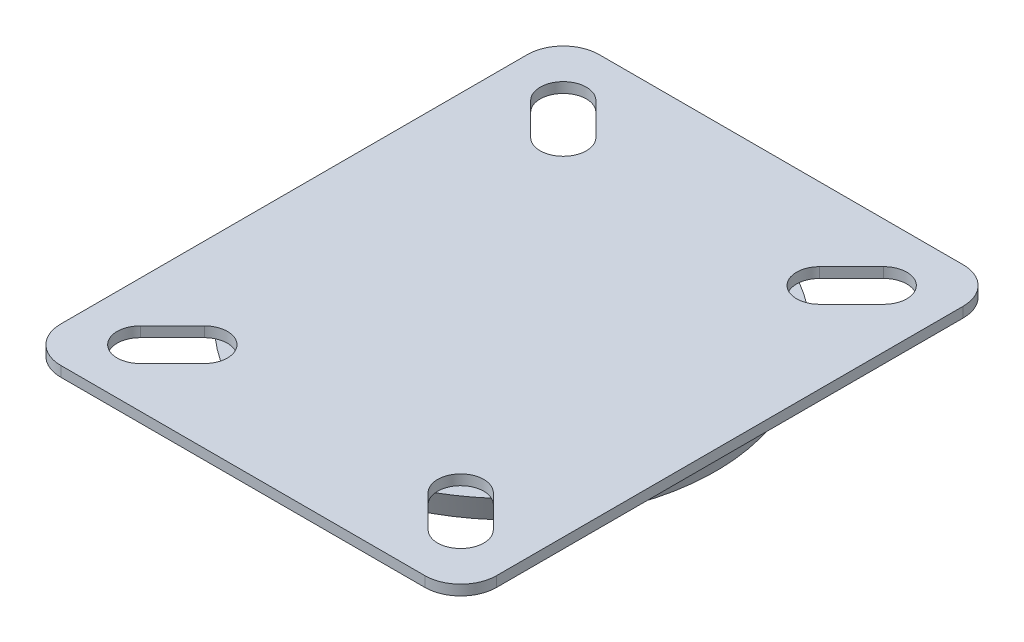
ISO-10303-21;
HEADER;
FILE_DESCRIPTION(('STEP AP214'),'2;1');
FILE_NAME('part.step','',(''),(''),'','','');
FILE_SCHEMA(('AUTOMOTIVE_DESIGN { 1 0 10303 214 1 1 1 1 }'));
ENDSEC;
DATA;
#1=APPLICATION_CONTEXT('core data for automotive mechanical design processes');
#2=APPLICATION_PROTOCOL_DEFINITION('international standard','automotive_design',2000,#1);
#3=PRODUCT_CONTEXT('',#1,'mechanical');
#4=PRODUCT('Part','Part','',(#3));
#5=PRODUCT_RELATED_PRODUCT_CATEGORY('part','',(#4));
#6=PRODUCT_DEFINITION_FORMATION('','',#4);
#7=PRODUCT_DEFINITION_CONTEXT('part definition',#1,'design');
#8=PRODUCT_DEFINITION('design','',#6,#7);
#9=PRODUCT_DEFINITION_SHAPE('','',#8);
#10=(LENGTH_UNIT() NAMED_UNIT(*) SI_UNIT(.MILLI.,.METRE.));
#11=(NAMED_UNIT(*) PLANE_ANGLE_UNIT() SI_UNIT($,.RADIAN.));
#12=(NAMED_UNIT(*) SI_UNIT($,.STERADIAN.) SOLID_ANGLE_UNIT());
#13=UNCERTAINTY_MEASURE_WITH_UNIT(LENGTH_MEASURE(1.E-05),#10,'distance_accuracy_value','');
#14=(GEOMETRIC_REPRESENTATION_CONTEXT(3) GLOBAL_UNCERTAINTY_ASSIGNED_CONTEXT((#13)) GLOBAL_UNIT_ASSIGNED_CONTEXT((#10,
#11,#12)) REPRESENTATION_CONTEXT('',''));
#15=CARTESIAN_POINT('',(0.,0.,0.));
#16=DIRECTION('',(0.,0.,1.));
#17=DIRECTION('',(1.,0.,0.));
#18=AXIS2_PLACEMENT_3D('',#15,#16,#17);
#19=CARTESIAN_POINT('',(-35.5,6.5,-45.5));
#20=DIRECTION('',(0.,-1.,0.));
#21=DIRECTION('',(0.,0.,-1.));
#22=AXIS2_PLACEMENT_3D('',#19,#20,#21);
#23=CYLINDRICAL_SURFACE('',#22,7.00000000000001);
#24=CARTESIAN_POINT('',(-35.5,4.5,-45.5));
#25=DIRECTION('',(0.,1.,0.));
#26=DIRECTION('',(1.,0.,0.));
#27=AXIS2_PLACEMENT_3D('',#24,#25,#26);
#28=CIRCLE('',#27,7.00000000000001);
#29=CARTESIAN_POINT('',(-35.5,4.5,-52.5));
#30=VERTEX_POINT('',#29);
#31=CARTESIAN_POINT('',(-42.5,4.5,-45.5));
#32=VERTEX_POINT('',#31);
#33=EDGE_CURVE('E364',#30,#32,#28,.T.);
#34=ORIENTED_EDGE('',*,*,#33,.T.);
#35=DIRECTION('',(0.,-1.,0.));
#36=VECTOR('',#35,1.);
#37=CARTESIAN_POINT('',(-42.5,6.5,-45.5));
#38=LINE('',#37,#36);
#39=CARTESIAN_POINT('',(-42.5,6.5,-45.5));
#40=VERTEX_POINT('',#39);
#41=EDGE_CURVE('E11',#40,#32,#38,.T.);
#42=ORIENTED_EDGE('',*,*,#41,.F.);
#43=CARTESIAN_POINT('',(-35.5,6.5,-45.5));
#44=DIRECTION('',(0.,1.,0.));
#45=DIRECTION('',(1.,0.,0.));
#46=AXIS2_PLACEMENT_3D('',#43,#44,#45);
#47=CIRCLE('',#46,7.00000000000001);
#48=CARTESIAN_POINT('',(-35.5,6.5,-52.5));
#49=VERTEX_POINT('',#48);
#50=EDGE_CURVE('E365',#49,#40,#47,.T.);
#51=ORIENTED_EDGE('',*,*,#50,.F.);
#52=DIRECTION('',(0.,-1.,0.));
#53=VECTOR('',#52,1.);
#54=CARTESIAN_POINT('',(-35.5,6.5,-52.5));
#55=LINE('',#54,#53);
#56=EDGE_CURVE('E383',#49,#30,#55,.T.);
#57=ORIENTED_EDGE('',*,*,#56,.T.);
#58=EDGE_LOOP('',(#34,#42,#51,#57));
#59=FACE_BOUND('',#58,.T.);
#60=ADVANCED_FACE('F16',(#59),#23,.T.);
#61=CARTESIAN_POINT('',(-42.5,6.5,-45.5));
#62=DIRECTION('',(1.,0.,0.));
#63=DIRECTION('',(0.,0.,-1.));
#64=AXIS2_PLACEMENT_3D('',#61,#62,#63);
#65=PLANE('',#64);
#66=DIRECTION('',(0.,0.,1.));
#67=VECTOR('',#66,1.);
#68=CARTESIAN_POINT('',(-42.5,4.5,-45.5));
#69=LINE('',#68,#67);
#70=CARTESIAN_POINT('',(-42.5,4.5,45.5));
#71=VERTEX_POINT('',#70);
#72=EDGE_CURVE('E386',#32,#71,#69,.T.);
#73=ORIENTED_EDGE('',*,*,#72,.T.);
#74=DIRECTION('',(0.,-1.,0.));
#75=VECTOR('',#74,1.);
#76=CARTESIAN_POINT('',(-42.5,6.5,45.5));
#77=LINE('',#76,#75);
#78=CARTESIAN_POINT('',(-42.5,6.5,45.5));
#79=VERTEX_POINT('',#78);
#80=EDGE_CURVE('E23',#79,#71,#77,.T.);
#81=ORIENTED_EDGE('',*,*,#80,.F.);
#82=DIRECTION('',(0.,0.,1.));
#83=VECTOR('',#82,1.);
#84=CARTESIAN_POINT('',(-42.5,6.5,-45.5));
#85=LINE('',#84,#83);
#86=EDGE_CURVE('E368',#40,#79,#85,.T.);
#87=ORIENTED_EDGE('',*,*,#86,.F.);
#88=ORIENTED_EDGE('',*,*,#41,.T.);
#89=EDGE_LOOP('',(#73,#81,#87,#88));
#90=FACE_BOUND('',#89,.T.);
#91=ADVANCED_FACE('F441',(#90),#65,.F.);
#92=CARTESIAN_POINT('',(-35.5,6.5,45.5));
#93=DIRECTION('',(0.,-1.,0.));
#94=DIRECTION('',(0.,0.,-1.));
#95=AXIS2_PLACEMENT_3D('',#92,#93,#94);
#96=CYLINDRICAL_SURFACE('',#95,7.00000000000001);
#97=CARTESIAN_POINT('',(-35.5,4.5,45.5));
#98=DIRECTION('',(0.,1.,0.));
#99=DIRECTION('',(1.,0.,0.));
#100=AXIS2_PLACEMENT_3D('',#97,#98,#99);
#101=CIRCLE('',#100,7.00000000000001);
#102=CARTESIAN_POINT('',(-35.5,4.5,52.5));
#103=VERTEX_POINT('',#102);
#104=EDGE_CURVE('E388',#71,#103,#101,.T.);
#105=ORIENTED_EDGE('',*,*,#104,.T.);
#106=DIRECTION('',(0.,-1.,0.));
#107=VECTOR('',#106,1.);
#108=CARTESIAN_POINT('',(-35.5,6.5,52.5));
#109=LINE('',#108,#107);
#110=CARTESIAN_POINT('',(-35.5,6.5,52.5));
#111=VERTEX_POINT('',#110);
#112=EDGE_CURVE('E413',#111,#103,#109,.T.);
#113=ORIENTED_EDGE('',*,*,#112,.F.);
#114=CARTESIAN_POINT('',(-35.5,6.5,45.5));
#115=DIRECTION('',(0.,1.,0.));
#116=DIRECTION('',(1.,0.,0.));
#117=AXIS2_PLACEMENT_3D('',#114,#115,#116);
#118=CIRCLE('',#117,7.00000000000001);
#119=EDGE_CURVE('E371',#79,#111,#118,.T.);
#120=ORIENTED_EDGE('',*,*,#119,.F.);
#121=ORIENTED_EDGE('',*,*,#80,.T.);
#122=EDGE_LOOP('',(#105,#113,#120,#121));
#123=FACE_BOUND('',#122,.T.);
#124=ADVANCED_FACE('F420',(#123),#96,.T.);
#125=CARTESIAN_POINT('',(-35.5,6.5,52.5));
#126=DIRECTION('',(0.,0.,-1.));
#127=DIRECTION('',(-1.,0.,0.));
#128=AXIS2_PLACEMENT_3D('',#125,#126,#127);
#129=PLANE('',#128);
#130=DIRECTION('',(1.,0.,0.));
#131=VECTOR('',#130,1.);
#132=CARTESIAN_POINT('',(-35.5,4.5,52.5));
#133=LINE('',#132,#131);
#134=CARTESIAN_POINT('',(35.5,4.5,52.5));
#135=VERTEX_POINT('',#134);
#136=EDGE_CURVE('E390',#103,#135,#133,.T.);
#137=ORIENTED_EDGE('',*,*,#136,.T.);
#138=DIRECTION('',(0.,-1.,0.));
#139=VECTOR('',#138,1.);
#140=CARTESIAN_POINT('',(35.5,6.5,52.5));
#141=LINE('',#140,#139);
#142=CARTESIAN_POINT('',(35.5,6.5,52.5));
#143=VERTEX_POINT('',#142);
#144=EDGE_CURVE('E410',#143,#135,#141,.T.);
#145=ORIENTED_EDGE('',*,*,#144,.F.);
#146=DIRECTION('',(1.,0.,0.));
#147=VECTOR('',#146,1.);
#148=CARTESIAN_POINT('',(-35.5,6.5,52.5));
#149=LINE('',#148,#147);
#150=EDGE_CURVE('E373',#111,#143,#149,.T.);
#151=ORIENTED_EDGE('',*,*,#150,.F.);
#152=ORIENTED_EDGE('',*,*,#112,.T.);
#153=EDGE_LOOP('',(#137,#145,#151,#152));
#154=FACE_BOUND('',#153,.T.);
#155=ADVANCED_FACE('F429',(#154),#129,.F.);
#156=CARTESIAN_POINT('',(35.5,6.5,45.5));
#157=DIRECTION('',(0.,-1.,0.));
#158=DIRECTION('',(0.,0.,-1.));
#159=AXIS2_PLACEMENT_3D('',#156,#157,#158);
#160=CYLINDRICAL_SURFACE('',#159,7.00000000000001);
#161=CARTESIAN_POINT('',(35.5,4.5,45.5));
#162=DIRECTION('',(0.,1.,0.));
#163=DIRECTION('',(1.,0.,0.));
#164=AXIS2_PLACEMENT_3D('',#161,#162,#163);
#165=CIRCLE('',#164,7.00000000000001);
#166=CARTESIAN_POINT('',(42.5,4.5,45.5));
#167=VERTEX_POINT('',#166);
#168=EDGE_CURVE('E392',#135,#167,#165,.T.);
#169=ORIENTED_EDGE('',*,*,#168,.T.);
#170=DIRECTION('',(0.,-1.,0.));
#171=VECTOR('',#170,1.);
#172=CARTESIAN_POINT('',(42.5,6.5,45.5));
#173=LINE('',#172,#171);
#174=CARTESIAN_POINT('',(42.5,6.5,45.5));
#175=VERTEX_POINT('',#174);
#176=EDGE_CURVE('E407',#175,#167,#173,.T.);
#177=ORIENTED_EDGE('',*,*,#176,.F.);
#178=CARTESIAN_POINT('',(35.5,6.5,45.5));
#179=DIRECTION('',(0.,1.,0.));
#180=DIRECTION('',(1.,0.,0.));
#181=AXIS2_PLACEMENT_3D('',#178,#179,#180);
#182=CIRCLE('',#181,7.00000000000001);
#183=EDGE_CURVE('E375',#143,#175,#182,.T.);
#184=ORIENTED_EDGE('',*,*,#183,.F.);
#185=ORIENTED_EDGE('',*,*,#144,.T.);
#186=EDGE_LOOP('',(#169,#177,#184,#185));
#187=FACE_BOUND('',#186,.T.);
#188=ADVANCED_FACE('F433',(#187),#160,.T.);
#189=CARTESIAN_POINT('',(42.5,6.5,45.5));
#190=DIRECTION('',(-1.,0.,0.));
#191=DIRECTION('',(0.,0.,1.));
#192=AXIS2_PLACEMENT_3D('',#189,#190,#191);
#193=PLANE('',#192);
#194=DIRECTION('',(0.,0.,-1.));
#195=VECTOR('',#194,1.);
#196=CARTESIAN_POINT('',(42.5,4.5,45.5));
#197=LINE('',#196,#195);
#198=CARTESIAN_POINT('',(42.5,4.5,-45.5));
#199=VERTEX_POINT('',#198);
#200=EDGE_CURVE('E394',#167,#199,#197,.T.);
#201=ORIENTED_EDGE('',*,*,#200,.T.);
#202=DIRECTION('',(0.,-1.,0.));
#203=VECTOR('',#202,1.);
#204=CARTESIAN_POINT('',(42.5,6.5,-45.5));
#205=LINE('',#204,#203);
#206=CARTESIAN_POINT('',(42.5,6.5,-45.5));
#207=VERTEX_POINT('',#206);
#208=EDGE_CURVE('E404',#207,#199,#205,.T.);
#209=ORIENTED_EDGE('',*,*,#208,.F.);
#210=DIRECTION('',(0.,0.,-1.));
#211=VECTOR('',#210,1.);
#212=CARTESIAN_POINT('',(42.5,6.5,45.5));
#213=LINE('',#212,#211);
#214=EDGE_CURVE('E377',#175,#207,#213,.T.);
#215=ORIENTED_EDGE('',*,*,#214,.F.);
#216=ORIENTED_EDGE('',*,*,#176,.T.);
#217=EDGE_LOOP('',(#201,#209,#215,#216));
#218=FACE_BOUND('',#217,.T.);
#219=ADVANCED_FACE('F454',(#218),#193,.F.);
#220=CARTESIAN_POINT('',(35.5,6.5,-45.5));
#221=DIRECTION('',(0.,-1.,0.));
#222=DIRECTION('',(0.,0.,-1.));
#223=AXIS2_PLACEMENT_3D('',#220,#221,#222);
#224=CYLINDRICAL_SURFACE('',#223,7.00000000000001);
#225=CARTESIAN_POINT('',(35.5,4.5,-45.5));
#226=DIRECTION('',(0.,1.,0.));
#227=DIRECTION('',(1.,0.,0.));
#228=AXIS2_PLACEMENT_3D('',#225,#226,#227);
#229=CIRCLE('',#228,7.00000000000001);
#230=CARTESIAN_POINT('',(35.5,4.5,-52.5));
#231=VERTEX_POINT('',#230);
#232=EDGE_CURVE('E396',#199,#231,#229,.T.);
#233=ORIENTED_EDGE('',*,*,#232,.T.);
#234=DIRECTION('',(0.,-1.,0.));
#235=VECTOR('',#234,1.);
#236=CARTESIAN_POINT('',(35.5,6.5,-52.5));
#237=LINE('',#236,#235);
#238=CARTESIAN_POINT('',(35.5,6.5,-52.5));
#239=VERTEX_POINT('',#238);
#240=EDGE_CURVE('E401',#239,#231,#237,.T.);
#241=ORIENTED_EDGE('',*,*,#240,.F.);
#242=CARTESIAN_POINT('',(35.5,6.5,-45.5));
#243=DIRECTION('',(0.,1.,0.));
#244=DIRECTION('',(1.,0.,0.));
#245=AXIS2_PLACEMENT_3D('',#242,#243,#244);
#246=CIRCLE('',#245,7.00000000000001);
#247=EDGE_CURVE('E379',#207,#239,#246,.T.);
#248=ORIENTED_EDGE('',*,*,#247,.F.);
#249=ORIENTED_EDGE('',*,*,#208,.T.);
#250=EDGE_LOOP('',(#233,#241,#248,#249));
#251=FACE_BOUND('',#250,.T.);
#252=ADVANCED_FACE('F452',(#251),#224,.T.);
#253=CARTESIAN_POINT('',(35.5,6.5,-52.5));
#254=DIRECTION('',(0.,0.,1.));
#255=DIRECTION('',(1.,0.,0.));
#256=AXIS2_PLACEMENT_3D('',#253,#254,#255);
#257=PLANE('',#256);
#258=DIRECTION('',(-1.,0.,0.));
#259=VECTOR('',#258,1.);
#260=CARTESIAN_POINT('',(35.5,4.5,-52.5));
#261=LINE('',#260,#259);
#262=EDGE_CURVE('E369',#231,#30,#261,.T.);
#263=ORIENTED_EDGE('',*,*,#262,.T.);
#264=ORIENTED_EDGE('',*,*,#56,.F.);
#265=DIRECTION('',(-1.,0.,0.));
#266=VECTOR('',#265,1.);
#267=CARTESIAN_POINT('',(35.5,6.5,-52.5));
#268=LINE('',#267,#266);
#269=EDGE_CURVE('E381',#239,#49,#268,.T.);
#270=ORIENTED_EDGE('',*,*,#269,.F.);
#271=ORIENTED_EDGE('',*,*,#240,.T.);
#272=EDGE_LOOP('',(#263,#264,#270,#271));
#273=FACE_BOUND('',#272,.T.);
#274=ADVANCED_FACE('F447',(#273),#257,.F.);
#275=CARTESIAN_POINT('',(-35.5,6.5,-45.5));
#276=DIRECTION('',(0.,1.,0.));
#277=DIRECTION('',(0.,0.,1.));
#278=AXIS2_PLACEMENT_3D('',#275,#276,#277);
#279=PLANE('',#278);
#280=CARTESIAN_POINT('',(-31.25,6.5,41.25));
#281=DIRECTION('',(0.,1.,0.));
#282=DIRECTION('',(1.,0.,0.));
#283=AXIS2_PLACEMENT_3D('',#280,#281,#282);
#284=CIRCLE('',#283,4.5);
#285=CARTESIAN_POINT('',(-34.4319805153395,6.5,38.0680194846605));
#286=VERTEX_POINT('',#285);
#287=CARTESIAN_POINT('',(-28.0680194846605,6.5,44.4319805153395));
#288=VERTEX_POINT('',#287);
#289=EDGE_CURVE('E250',#286,#288,#284,.T.);
#290=ORIENTED_EDGE('',*,*,#289,.F.);
#291=DIRECTION('',(-0.707106781186546,0.,0.707106781186549));
#292=VECTOR('',#291,1.);
#293=CARTESIAN_POINT('',(-28.1819805153395,6.5,31.8180194846605));
#294=LINE('',#293,#292);
#295=CARTESIAN_POINT('',(-28.1819805153395,6.5,31.8180194846605));
#296=VERTEX_POINT('',#295);
#297=EDGE_CURVE('E248',#296,#286,#294,.T.);
#298=ORIENTED_EDGE('',*,*,#297,.F.);
#299=CARTESIAN_POINT('',(-25.,6.5,35.));
#300=DIRECTION('',(0.,1.,0.));
#301=DIRECTION('',(1.,0.,0.));
#302=AXIS2_PLACEMENT_3D('',#299,#300,#301);
#303=CIRCLE('',#302,4.50000000000001);
#304=CARTESIAN_POINT('',(-21.8180194846605,6.5,38.1819805153395));
#305=VERTEX_POINT('',#304);
#306=EDGE_CURVE('E255',#305,#296,#303,.T.);
#307=ORIENTED_EDGE('',*,*,#306,.F.);
#308=DIRECTION('',(0.707106781186548,0.,-0.707106781186547));
#309=VECTOR('',#308,1.);
#310=CARTESIAN_POINT('',(-28.0680194846605,6.5,44.4319805153395));
#311=LINE('',#310,#309);
#312=EDGE_CURVE('E252',#288,#305,#311,.T.);
#313=ORIENTED_EDGE('',*,*,#312,.F.);
#314=EDGE_LOOP('',(#290,#298,#307,#313));
#315=FACE_BOUND('',#314,.T.);
#316=CARTESIAN_POINT('',(-31.2499998735595,6.5,-41.2499998735595));
#317=DIRECTION('',(0.,1.,0.));
#318=DIRECTION('',(1.,0.,0.));
#319=AXIS2_PLACEMENT_3D('',#316,#317,#318);
#320=CIRCLE('',#319,4.5);
#321=CARTESIAN_POINT('',(-28.0680194846605,6.5,-44.4319805153395));
#322=VERTEX_POINT('',#321);
#323=CARTESIAN_POINT('',(-34.4319805153395,6.5,-38.0680194846605));
#324=VERTEX_POINT('',#323);
#325=EDGE_CURVE('E274',#322,#324,#320,.T.);
#326=ORIENTED_EDGE('',*,*,#325,.F.);
#327=DIRECTION('',(-0.707106781186548,0.,-0.707106781186547));
#328=VECTOR('',#327,1.);
#329=CARTESIAN_POINT('',(-21.8180194846605,6.5,-38.1819805153395));
#330=LINE('',#329,#328);
#331=CARTESIAN_POINT('',(-21.8180194846605,6.5,-38.1819805153395));
#332=VERTEX_POINT('',#331);
#333=EDGE_CURVE('E272',#332,#322,#330,.T.);
#334=ORIENTED_EDGE('',*,*,#333,.F.);
#335=CARTESIAN_POINT('',(-25.,6.5,-35.));
#336=DIRECTION('',(0.,1.,0.));
#337=DIRECTION('',(1.,0.,0.));
#338=AXIS2_PLACEMENT_3D('',#335,#336,#337);
#339=CIRCLE('',#338,4.50000000000001);
#340=CARTESIAN_POINT('',(-28.1819805153395,6.5,-31.8180194846605));
#341=VERTEX_POINT('',#340);
#342=EDGE_CURVE('E279',#341,#332,#339,.T.);
#343=ORIENTED_EDGE('',*,*,#342,.F.);
#344=DIRECTION('',(0.707106781186546,0.,0.707106781186549));
#345=VECTOR('',#344,1.);
#346=CARTESIAN_POINT('',(-34.4319805153395,6.5,-38.0680194846605));
#347=LINE('',#346,#345);
#348=EDGE_CURVE('E276',#324,#341,#347,.T.);
#349=ORIENTED_EDGE('',*,*,#348,.F.);
#350=EDGE_LOOP('',(#326,#334,#343,#349));
#351=FACE_BOUND('',#350,.T.);
#352=CARTESIAN_POINT('',(25.,6.5,35.));
#353=DIRECTION('',(0.,1.,0.));
#354=DIRECTION('',(1.,0.,0.));
#355=AXIS2_PLACEMENT_3D('',#352,#353,#354);
#356=CIRCLE('',#355,4.50000000000002);
#357=CARTESIAN_POINT('',(28.1819805153395,6.5,31.8180194846605));
#358=VERTEX_POINT('',#357);
#359=CARTESIAN_POINT('',(21.8180194846605,6.5,38.1819805153395));
#360=VERTEX_POINT('',#359);
#361=EDGE_CURVE('E303',#358,#360,#356,.T.);
#362=ORIENTED_EDGE('',*,*,#361,.F.);
#363=DIRECTION('',(-0.707106781186546,0.,-0.707106781186549));
#364=VECTOR('',#363,1.);
#365=CARTESIAN_POINT('',(34.4319805153395,6.5,38.0680194846605));
#366=LINE('',#365,#364);
#367=CARTESIAN_POINT('',(34.4319805153395,6.5,38.0680194846605));
#368=VERTEX_POINT('',#367);
#369=EDGE_CURVE('E301',#368,#358,#366,.T.);
#370=ORIENTED_EDGE('',*,*,#369,.F.);
#371=CARTESIAN_POINT('',(31.25,6.5,41.25));
#372=DIRECTION('',(0.,1.,0.));
#373=DIRECTION('',(1.,0.,0.));
#374=AXIS2_PLACEMENT_3D('',#371,#372,#373);
#375=CIRCLE('',#374,4.5);
#376=CARTESIAN_POINT('',(28.0680194846605,6.5,44.4319805153395));
#377=VERTEX_POINT('',#376);
#378=EDGE_CURVE('E309',#377,#368,#375,.T.);
#379=ORIENTED_EDGE('',*,*,#378,.F.);
#380=DIRECTION('',(0.707106781186547,0.,0.707106781186547));
#381=VECTOR('',#380,1.);
#382=CARTESIAN_POINT('',(21.8180194846605,6.5,38.1819805153395));
#383=LINE('',#382,#381);
#384=EDGE_CURVE('E306',#360,#377,#383,.T.);
#385=ORIENTED_EDGE('',*,*,#384,.F.);
#386=EDGE_LOOP('',(#362,#370,#379,#385));
#387=FACE_BOUND('',#386,.T.);
#388=CARTESIAN_POINT('',(25.,6.5,-35.));
#389=DIRECTION('',(0.,1.,0.));
#390=DIRECTION('',(1.,0.,0.));
#391=AXIS2_PLACEMENT_3D('',#388,#389,#390);
#392=CIRCLE('',#391,4.5);
#393=CARTESIAN_POINT('',(21.8180194846605,6.5,-38.1819805153395));
#394=VERTEX_POINT('',#393);
#395=CARTESIAN_POINT('',(28.1819805153395,6.5,-31.8180194846605));
#396=VERTEX_POINT('',#395);
#397=EDGE_CURVE('E335',#394,#396,#392,.T.);
#398=ORIENTED_EDGE('',*,*,#397,.F.);
#399=DIRECTION('',(-0.707106781186547,0.,0.707106781186547));
#400=VECTOR('',#399,1.);
#401=CARTESIAN_POINT('',(28.0680194846605,6.5,-44.4319805153395));
#402=LINE('',#401,#400);
#403=CARTESIAN_POINT('',(28.0680194846605,6.5,-44.4319805153395));
#404=VERTEX_POINT('',#403);
#405=EDGE_CURVE('E333',#404,#394,#402,.T.);
#406=ORIENTED_EDGE('',*,*,#405,.F.);
#407=CARTESIAN_POINT('',(31.25,6.5,-41.25));
#408=DIRECTION('',(0.,1.,0.));
#409=DIRECTION('',(1.,0.,0.));
#410=AXIS2_PLACEMENT_3D('',#407,#408,#409);
#411=CIRCLE('',#410,4.49999999999999);
#412=CARTESIAN_POINT('',(34.4319805153395,6.5,-38.0680194846605));
#413=VERTEX_POINT('',#412);
#414=EDGE_CURVE('E341',#413,#404,#411,.T.);
#415=ORIENTED_EDGE('',*,*,#414,.F.);
#416=DIRECTION('',(0.707106781186547,0.,-0.707106781186548));
#417=VECTOR('',#416,1.);
#418=CARTESIAN_POINT('',(28.1819805153395,6.5,-31.8180194846605));
#419=LINE('',#418,#417);
#420=EDGE_CURVE('E338',#396,#413,#419,.T.);
#421=ORIENTED_EDGE('',*,*,#420,.F.);
#422=EDGE_LOOP('',(#398,#406,#415,#421));
#423=FACE_BOUND('',#422,.T.);
#424=ORIENTED_EDGE('',*,*,#50,.T.);
#425=ORIENTED_EDGE('',*,*,#86,.T.);
#426=ORIENTED_EDGE('',*,*,#119,.T.);
#427=ORIENTED_EDGE('',*,*,#150,.T.);
#428=ORIENTED_EDGE('',*,*,#183,.T.);
#429=ORIENTED_EDGE('',*,*,#214,.T.);
#430=ORIENTED_EDGE('',*,*,#247,.T.);
#431=ORIENTED_EDGE('',*,*,#269,.T.);
#432=EDGE_LOOP('',(#424,#425,#426,#427,#428,#429,#430,#431));
#433=FACE_BOUND('',#432,.T.);
#434=ADVANCED_FACE('F437',(#315,#351,#387,#423,#433),#279,.T.);
#435=CARTESIAN_POINT('',(-35.5,4.5,-45.5));
#436=DIRECTION('',(0.,1.,0.));
#437=DIRECTION('',(0.,0.,1.));
#438=AXIS2_PLACEMENT_3D('',#435,#436,#437);
#439=PLANE('',#438);
#440=CARTESIAN_POINT('',(0.,4.5,0.));
#441=DIRECTION('',(0.,-1.,0.));
#442=DIRECTION('',(0.,0.,-1.));
#443=AXIS2_PLACEMENT_3D('',#440,#441,#442);
#444=CIRCLE('',#443,41.);
#445=CARTESIAN_POINT('',(20.5269202999235,4.5,35.4914855000539));
#446=VERTEX_POINT('',#445);
#447=CARTESIAN_POINT('',(-20.5269202999235,4.5,35.4914855000546));
#448=VERTEX_POINT('',#447);
#449=EDGE_CURVE('E236',#446,#448,#444,.T.);
#450=ORIENTED_EDGE('',*,*,#449,.F.);
#451=CARTESIAN_POINT('',(25.,4.5,35.));
#452=DIRECTION('',(0.,1.,0.));
#453=DIRECTION('',(1.,0.,0.));
#454=AXIS2_PLACEMENT_3D('',#451,#452,#453);
#455=CIRCLE('',#454,4.50000000000002);
#456=CARTESIAN_POINT('',(21.8180194846605,4.5,38.1819805153395));
#457=VERTEX_POINT('',#456);
#458=EDGE_CURVE('E314',#446,#457,#455,.T.);
#459=ORIENTED_EDGE('',*,*,#458,.T.);
#460=DIRECTION('',(0.707106781186547,0.,0.707106781186547));
#461=VECTOR('',#460,1.);
#462=CARTESIAN_POINT('',(21.8180194846605,4.5,38.1819805153395));
#463=LINE('',#462,#461);
#464=CARTESIAN_POINT('',(28.0680194846605,4.5,44.4319805153395));
#465=VERTEX_POINT('',#464);
#466=EDGE_CURVE('E317',#457,#465,#463,.T.);
#467=ORIENTED_EDGE('',*,*,#466,.T.);
#468=CARTESIAN_POINT('',(31.25,4.5,41.25));
#469=DIRECTION('',(0.,1.,0.));
#470=DIRECTION('',(1.,0.,0.));
#471=AXIS2_PLACEMENT_3D('',#468,#469,#470);
#472=CIRCLE('',#471,4.5);
#473=CARTESIAN_POINT('',(34.4319805153395,4.5,38.0680194846605));
#474=VERTEX_POINT('',#473);
#475=EDGE_CURVE('E304',#465,#474,#472,.T.);
#476=ORIENTED_EDGE('',*,*,#475,.T.);
#477=DIRECTION('',(-0.707106781186546,0.,-0.707106781186549));
#478=VECTOR('',#477,1.);
#479=CARTESIAN_POINT('',(34.4319805153395,4.5,38.0680194846605));
#480=LINE('',#479,#478);
#481=CARTESIAN_POINT('',(28.1819805153395,4.5,31.8180194846605));
#482=VERTEX_POINT('',#481);
#483=EDGE_CURVE('E300',#474,#482,#480,.T.);
#484=ORIENTED_EDGE('',*,*,#483,.T.);
#485=CARTESIAN_POINT('',(26.9156472676443,4.5,30.9281090945401));
#486=VERTEX_POINT('',#485);
#487=EDGE_CURVE('E315',#482,#486,#455,.T.);
#488=ORIENTED_EDGE('',*,*,#487,.T.);
#489=CARTESIAN_POINT('',(26.9156472676442,4.5,-30.9281090945401));
#490=VERTEX_POINT('',#489);
#491=EDGE_CURVE('E30',#490,#486,#444,.T.);
#492=ORIENTED_EDGE('',*,*,#491,.F.);
#493=CARTESIAN_POINT('',(25.,4.5,-35.));
#494=DIRECTION('',(0.,1.,0.));
#495=DIRECTION('',(1.,0.,0.));
#496=AXIS2_PLACEMENT_3D('',#493,#494,#495);
#497=CIRCLE('',#496,4.5);
#498=CARTESIAN_POINT('',(28.1819805153395,4.5,-31.8180194846605));
#499=VERTEX_POINT('',#498);
#500=EDGE_CURVE('E346',#490,#499,#497,.T.);
#501=ORIENTED_EDGE('',*,*,#500,.T.);
#502=DIRECTION('',(0.707106781186547,0.,-0.707106781186548));
#503=VECTOR('',#502,1.);
#504=CARTESIAN_POINT('',(28.1819805153395,4.5,-31.8180194846605));
#505=LINE('',#504,#503);
#506=CARTESIAN_POINT('',(34.4319805153395,4.5,-38.0680194846605));
#507=VERTEX_POINT('',#506);
#508=EDGE_CURVE('E349',#499,#507,#505,.T.);
#509=ORIENTED_EDGE('',*,*,#508,.T.);
#510=CARTESIAN_POINT('',(31.25,4.5,-41.25));
#511=DIRECTION('',(0.,1.,0.));
#512=DIRECTION('',(1.,0.,0.));
#513=AXIS2_PLACEMENT_3D('',#510,#511,#512);
#514=CIRCLE('',#513,4.49999999999999);
#515=CARTESIAN_POINT('',(28.0680194846605,4.5,-44.4319805153395));
#516=VERTEX_POINT('',#515);
#517=EDGE_CURVE('E336',#507,#516,#514,.T.);
#518=ORIENTED_EDGE('',*,*,#517,.T.);
#519=DIRECTION('',(-0.707106781186547,0.,0.707106781186547));
#520=VECTOR('',#519,1.);
#521=CARTESIAN_POINT('',(28.0680194846605,4.5,-44.4319805153395));
#522=LINE('',#521,#520);
#523=CARTESIAN_POINT('',(21.8180194846605,4.5,-38.1819805153395));
#524=VERTEX_POINT('',#523);
#525=EDGE_CURVE('E332',#516,#524,#522,.T.);
#526=ORIENTED_EDGE('',*,*,#525,.T.);
#527=CARTESIAN_POINT('',(20.5269202999235,4.5,-35.4914855000546));
#528=VERTEX_POINT('',#527);
#529=EDGE_CURVE('E347',#524,#528,#497,.T.);
#530=ORIENTED_EDGE('',*,*,#529,.T.);
#531=CARTESIAN_POINT('',(-20.5269202999235,4.5,-35.4914855000539));
#532=VERTEX_POINT('',#531);
#533=EDGE_CURVE('E742',#532,#528,#444,.T.);
#534=ORIENTED_EDGE('',*,*,#533,.F.);
#535=CARTESIAN_POINT('',(-25.,4.5,-35.));
#536=DIRECTION('',(0.,1.,0.));
#537=DIRECTION('',(1.,0.,0.));
#538=AXIS2_PLACEMENT_3D('',#535,#536,#537);
#539=CIRCLE('',#538,4.50000000000001);
#540=CARTESIAN_POINT('',(-21.8180194846605,4.5,-38.1819805153395));
#541=VERTEX_POINT('',#540);
#542=EDGE_CURVE('E289',#532,#541,#539,.T.);
#543=ORIENTED_EDGE('',*,*,#542,.T.);
#544=DIRECTION('',(-0.707106781186548,0.,-0.707106781186547));
#545=VECTOR('',#544,1.);
#546=CARTESIAN_POINT('',(-21.8180194846605,4.5,-38.1819805153395));
#547=LINE('',#546,#545);
#548=CARTESIAN_POINT('',(-28.0680194846605,4.5,-44.4319805153395));
#549=VERTEX_POINT('',#548);
#550=EDGE_CURVE('E271',#541,#549,#547,.T.);
#551=ORIENTED_EDGE('',*,*,#550,.T.);
#552=CARTESIAN_POINT('',(-31.2499998735595,4.5,-41.2499998735595));
#553=DIRECTION('',(0.,1.,0.));
#554=DIRECTION('',(1.,0.,0.));
#555=AXIS2_PLACEMENT_3D('',#552,#553,#554);
#556=CIRCLE('',#555,4.5);
#557=CARTESIAN_POINT('',(-34.4319805153395,4.5,-38.0680194846605));
#558=VERTEX_POINT('',#557);
#559=EDGE_CURVE('E284',#549,#558,#556,.T.);
#560=ORIENTED_EDGE('',*,*,#559,.T.);
#561=DIRECTION('',(0.707106781186546,0.,0.707106781186549));
#562=VECTOR('',#561,1.);
#563=CARTESIAN_POINT('',(-34.4319805153395,4.5,-38.0680194846605));
#564=LINE('',#563,#562);
#565=CARTESIAN_POINT('',(-28.1819805153395,4.5,-31.8180194846605));
#566=VERTEX_POINT('',#565);
#567=EDGE_CURVE('E287',#558,#566,#564,.T.);
#568=ORIENTED_EDGE('',*,*,#567,.T.);
#569=CARTESIAN_POINT('',(-26.9156472676443,4.5,-30.9281090945401));
#570=VERTEX_POINT('',#569);
#571=EDGE_CURVE('E221',#566,#570,#539,.T.);
#572=ORIENTED_EDGE('',*,*,#571,.T.);
#573=CARTESIAN_POINT('',(-26.915647267644,4.5,30.92810909454));
#574=VERTEX_POINT('',#573);
#575=EDGE_CURVE('E216',#574,#570,#444,.T.);
#576=ORIENTED_EDGE('',*,*,#575,.F.);
#577=CARTESIAN_POINT('',(-25.,4.5,35.));
#578=DIRECTION('',(0.,1.,0.));
#579=DIRECTION('',(1.,0.,0.));
#580=AXIS2_PLACEMENT_3D('',#577,#578,#579);
#581=CIRCLE('',#580,4.50000000000001);
#582=CARTESIAN_POINT('',(-28.1819805153395,4.5,31.8180194846605));
#583=VERTEX_POINT('',#582);
#584=EDGE_CURVE('E200',#574,#583,#581,.T.);
#585=ORIENTED_EDGE('',*,*,#584,.T.);
#586=DIRECTION('',(-0.707106781186546,0.,0.707106781186549));
#587=VECTOR('',#586,1.);
#588=CARTESIAN_POINT('',(-28.1819805153395,4.5,31.8180194846605));
#589=LINE('',#588,#587);
#590=CARTESIAN_POINT('',(-34.4319805153395,4.5,38.0680194846605));
#591=VERTEX_POINT('',#590);
#592=EDGE_CURVE('E247',#583,#591,#589,.T.);
#593=ORIENTED_EDGE('',*,*,#592,.T.);
#594=CARTESIAN_POINT('',(-31.25,4.5,41.25));
#595=DIRECTION('',(0.,1.,0.));
#596=DIRECTION('',(1.,0.,0.));
#597=AXIS2_PLACEMENT_3D('',#594,#595,#596);
#598=CIRCLE('',#597,4.5);
#599=CARTESIAN_POINT('',(-28.0680194846605,4.5,44.4319805153395));
#600=VERTEX_POINT('',#599);
#601=EDGE_CURVE('E258',#591,#600,#598,.T.);
#602=ORIENTED_EDGE('',*,*,#601,.T.);
#603=DIRECTION('',(0.707106781186548,0.,-0.707106781186547));
#604=VECTOR('',#603,1.);
#605=CARTESIAN_POINT('',(-28.0680194846605,4.5,44.4319805153395));
#606=LINE('',#605,#604);
#607=CARTESIAN_POINT('',(-21.8180194846605,4.5,38.1819805153395));
#608=VERTEX_POINT('',#607);
#609=EDGE_CURVE('E211',#600,#608,#606,.T.);
#610=ORIENTED_EDGE('',*,*,#609,.T.);
#611=EDGE_CURVE('E213',#608,#448,#581,.T.);
#612=ORIENTED_EDGE('',*,*,#611,.T.);
#613=EDGE_LOOP('',(#450,#459,#467,#476,#484,#488,#492,#501,#509,#518,#526,#530,#534,#543,#551,
#560,#568,#572,#576,#585,#593,#602,#610,#612));
#614=FACE_BOUND('',#613,.T.);
#615=ORIENTED_EDGE('',*,*,#33,.F.);
#616=ORIENTED_EDGE('',*,*,#262,.F.);
#617=ORIENTED_EDGE('',*,*,#232,.F.);
#618=ORIENTED_EDGE('',*,*,#200,.F.);
#619=ORIENTED_EDGE('',*,*,#168,.F.);
#620=ORIENTED_EDGE('',*,*,#136,.F.);
#621=ORIENTED_EDGE('',*,*,#104,.F.);
#622=ORIENTED_EDGE('',*,*,#72,.F.);
#623=EDGE_LOOP('',(#615,#616,#617,#618,#619,#620,#621,#622));
#624=FACE_BOUND('',#623,.T.);
#625=ADVANCED_FACE('F217',(#614,#624),#439,.F.);
#626=CARTESIAN_POINT('',(28.0680194846605,6.5,-44.4319805153395));
#627=DIRECTION('',(0.707106781186547,0.,0.707106781186547));
#628=DIRECTION('',(0.707106781186548,0.,-0.707106781186548));
#629=AXIS2_PLACEMENT_3D('',#626,#627,#628);
#630=PLANE('',#629);
#631=ORIENTED_EDGE('',*,*,#525,.F.);
#632=DIRECTION('',(0.,-1.,0.));
#633=VECTOR('',#632,1.);
#634=CARTESIAN_POINT('',(28.0680194846605,6.5,-44.4319805153395));
#635=LINE('',#634,#633);
#636=EDGE_CURVE('E343',#404,#516,#635,.T.);
#637=ORIENTED_EDGE('',*,*,#636,.F.);
#638=ORIENTED_EDGE('',*,*,#405,.T.);
#639=DIRECTION('',(0.,-1.,0.));
#640=VECTOR('',#639,1.);
#641=CARTESIAN_POINT('',(21.8180194846605,6.5,-38.1819805153395));
#642=LINE('',#641,#640);
#643=EDGE_CURVE('E361',#394,#524,#642,.T.);
#644=ORIENTED_EDGE('',*,*,#643,.T.);
#645=EDGE_LOOP('',(#631,#637,#638,#644));
#646=FACE_BOUND('',#645,.T.);
#647=ADVANCED_FACE('F526',(#646),#630,.T.);
#648=CARTESIAN_POINT('',(25.,6.5,-35.));
#649=DIRECTION('',(0.,-1.,0.));
#650=DIRECTION('',(0.,0.,-1.));
#651=AXIS2_PLACEMENT_3D('',#648,#649,#650);
#652=CYLINDRICAL_SURFACE('',#651,4.5);
#653=ORIENTED_EDGE('',*,*,#529,.F.);
#654=ORIENTED_EDGE('',*,*,#643,.F.);
#655=ORIENTED_EDGE('',*,*,#397,.T.);
#656=DIRECTION('',(0.,-1.,0.));
#657=VECTOR('',#656,1.);
#658=CARTESIAN_POINT('',(28.1819805153395,6.5,-31.8180194846605));
#659=LINE('',#658,#657);
#660=EDGE_CURVE('E358',#396,#499,#659,.T.);
#661=ORIENTED_EDGE('',*,*,#660,.T.);
#662=ORIENTED_EDGE('',*,*,#500,.F.);
#663=CARTESIAN_POINT('',(25.,4.5,-35.));
#664=DIRECTION('',(0.,-1.,0.));
#665=DIRECTION('',(0.,0.,-1.));
#666=AXIS2_PLACEMENT_3D('',#663,#664,#665);
#667=CIRCLE('',#666,4.5);
#668=EDGE_CURVE('E37',#490,#528,#667,.T.);
#669=ORIENTED_EDGE('',*,*,#668,.T.);
#670=EDGE_LOOP('',(#653,#654,#655,#661,#662,#669));
#671=FACE_BOUND('',#670,.T.);
#672=ADVANCED_FACE('F535',(#671),#652,.F.);
#673=CARTESIAN_POINT('',(28.1819805153395,6.5,-31.8180194846605));
#674=DIRECTION('',(-0.707106781186548,0.,-0.707106781186547));
#675=DIRECTION('',(-0.707106781186547,0.,0.707106781186548));
#676=AXIS2_PLACEMENT_3D('',#673,#674,#675);
#677=PLANE('',#676);
#678=ORIENTED_EDGE('',*,*,#508,.F.);
#679=ORIENTED_EDGE('',*,*,#660,.F.);
#680=ORIENTED_EDGE('',*,*,#420,.T.);
#681=DIRECTION('',(0.,-1.,0.));
#682=VECTOR('',#681,1.);
#683=CARTESIAN_POINT('',(34.4319805153395,6.5,-38.0680194846605));
#684=LINE('',#683,#682);
#685=EDGE_CURVE('E356',#413,#507,#684,.T.);
#686=ORIENTED_EDGE('',*,*,#685,.T.);
#687=EDGE_LOOP('',(#678,#679,#680,#686));
#688=FACE_BOUND('',#687,.T.);
#689=ADVANCED_FACE('F545',(#688),#677,.T.);
#690=CARTESIAN_POINT('',(31.25,6.5,-41.25));
#691=DIRECTION('',(0.,-1.,0.));
#692=DIRECTION('',(0.,0.,-1.));
#693=AXIS2_PLACEMENT_3D('',#690,#691,#692);
#694=CYLINDRICAL_SURFACE('',#693,4.49999999999999);
#695=ORIENTED_EDGE('',*,*,#517,.F.);
#696=ORIENTED_EDGE('',*,*,#685,.F.);
#697=ORIENTED_EDGE('',*,*,#414,.T.);
#698=ORIENTED_EDGE('',*,*,#636,.T.);
#699=EDGE_LOOP('',(#695,#696,#697,#698));
#700=FACE_BOUND('',#699,.T.);
#701=ADVANCED_FACE('F554',(#700),#694,.F.);
#702=CARTESIAN_POINT('',(34.4319805153395,6.5,38.0680194846605));
#703=DIRECTION('',(-0.707106781186549,0.,0.707106781186546));
#704=DIRECTION('',(0.707106781186546,0.,0.707106781186549));
#705=AXIS2_PLACEMENT_3D('',#702,#703,#704);
#706=PLANE('',#705);
#707=ORIENTED_EDGE('',*,*,#483,.F.);
#708=DIRECTION('',(0.,-1.,0.));
#709=VECTOR('',#708,1.);
#710=CARTESIAN_POINT('',(34.4319805153395,6.5,38.0680194846605));
#711=LINE('',#710,#709);
#712=EDGE_CURVE('E311',#368,#474,#711,.T.);
#713=ORIENTED_EDGE('',*,*,#712,.F.);
#714=ORIENTED_EDGE('',*,*,#369,.T.);
#715=DIRECTION('',(0.,-1.,0.));
#716=VECTOR('',#715,1.);
#717=CARTESIAN_POINT('',(28.1819805153395,6.5,31.8180194846605));
#718=LINE('',#717,#716);
#719=EDGE_CURVE('E329',#358,#482,#718,.T.);
#720=ORIENTED_EDGE('',*,*,#719,.T.);
#721=EDGE_LOOP('',(#707,#713,#714,#720));
#722=FACE_BOUND('',#721,.T.);
#723=ADVANCED_FACE('F564',(#722),#706,.T.);
#724=CARTESIAN_POINT('',(25.,6.5,35.));
#725=DIRECTION('',(0.,-1.,0.));
#726=DIRECTION('',(0.,0.,-1.));
#727=AXIS2_PLACEMENT_3D('',#724,#725,#726);
#728=CYLINDRICAL_SURFACE('',#727,4.50000000000002);
#729=ORIENTED_EDGE('',*,*,#487,.F.);
#730=ORIENTED_EDGE('',*,*,#719,.F.);
#731=ORIENTED_EDGE('',*,*,#361,.T.);
#732=DIRECTION('',(0.,-1.,0.));
#733=VECTOR('',#732,1.);
#734=CARTESIAN_POINT('',(21.8180194846605,6.5,38.1819805153395));
#735=LINE('',#734,#733);
#736=EDGE_CURVE('E326',#360,#457,#735,.T.);
#737=ORIENTED_EDGE('',*,*,#736,.T.);
#738=ORIENTED_EDGE('',*,*,#458,.F.);
#739=CARTESIAN_POINT('',(25.,4.5,35.));
#740=DIRECTION('',(0.,-1.,0.));
#741=DIRECTION('',(0.,0.,-1.));
#742=AXIS2_PLACEMENT_3D('',#739,#740,#741);
#743=CIRCLE('',#742,4.50000000000002);
#744=EDGE_CURVE('E244',#446,#486,#743,.T.);
#745=ORIENTED_EDGE('',*,*,#744,.T.);
#746=EDGE_LOOP('',(#729,#730,#731,#737,#738,#745));
#747=FACE_BOUND('',#746,.T.);
#748=ADVANCED_FACE('F574',(#747),#728,.F.);
#749=CARTESIAN_POINT('',(21.8180194846605,6.5,38.1819805153395));
#750=DIRECTION('',(0.707106781186547,0.,-0.707106781186547));
#751=DIRECTION('',(-0.707106781186548,0.,-0.707106781186548));
#752=AXIS2_PLACEMENT_3D('',#749,#750,#751);
#753=PLANE('',#752);
#754=ORIENTED_EDGE('',*,*,#466,.F.);
#755=ORIENTED_EDGE('',*,*,#736,.F.);
#756=ORIENTED_EDGE('',*,*,#384,.T.);
#757=DIRECTION('',(0.,-1.,0.));
#758=VECTOR('',#757,1.);
#759=CARTESIAN_POINT('',(28.0680194846605,6.5,44.4319805153395));
#760=LINE('',#759,#758);
#761=EDGE_CURVE('E324',#377,#465,#760,.T.);
#762=ORIENTED_EDGE('',*,*,#761,.T.);
#763=EDGE_LOOP('',(#754,#755,#756,#762));
#764=FACE_BOUND('',#763,.T.);
#765=ADVANCED_FACE('F584',(#764),#753,.T.);
#766=CARTESIAN_POINT('',(31.25,6.5,41.25));
#767=DIRECTION('',(0.,-1.,0.));
#768=DIRECTION('',(0.,0.,-1.));
#769=AXIS2_PLACEMENT_3D('',#766,#767,#768);
#770=CYLINDRICAL_SURFACE('',#769,4.5);
#771=ORIENTED_EDGE('',*,*,#475,.F.);
#772=ORIENTED_EDGE('',*,*,#761,.F.);
#773=ORIENTED_EDGE('',*,*,#378,.T.);
#774=ORIENTED_EDGE('',*,*,#712,.T.);
#775=EDGE_LOOP('',(#771,#772,#773,#774));
#776=FACE_BOUND('',#775,.T.);
#777=ADVANCED_FACE('F594',(#776),#770,.F.);
#778=CARTESIAN_POINT('',(-21.8180194846605,6.5,-38.1819805153395));
#779=DIRECTION('',(-0.707106781186547,0.,0.707106781186548));
#780=DIRECTION('',(0.707106781186548,0.,0.707106781186547));
#781=AXIS2_PLACEMENT_3D('',#778,#779,#780);
#782=PLANE('',#781);
#783=ORIENTED_EDGE('',*,*,#550,.F.);
#784=DIRECTION('',(0.,-1.,0.));
#785=VECTOR('',#784,1.);
#786=CARTESIAN_POINT('',(-21.8180194846605,6.5,-38.1819805153395));
#787=LINE('',#786,#785);
#788=EDGE_CURVE('E281',#332,#541,#787,.T.);
#789=ORIENTED_EDGE('',*,*,#788,.F.);
#790=ORIENTED_EDGE('',*,*,#333,.T.);
#791=DIRECTION('',(0.,-1.,0.));
#792=VECTOR('',#791,1.);
#793=CARTESIAN_POINT('',(-28.0680194846605,6.5,-44.4319805153395));
#794=LINE('',#793,#792);
#795=EDGE_CURVE('E297',#322,#549,#794,.T.);
#796=ORIENTED_EDGE('',*,*,#795,.T.);
#797=EDGE_LOOP('',(#783,#789,#790,#796));
#798=FACE_BOUND('',#797,.T.);
#799=ADVANCED_FACE('F604',(#798),#782,.T.);
#800=CARTESIAN_POINT('',(-31.2499998735595,6.5,-41.2499998735595));
#801=DIRECTION('',(0.,-1.,0.));
#802=DIRECTION('',(0.,0.,-1.));
#803=AXIS2_PLACEMENT_3D('',#800,#801,#802);
#804=CYLINDRICAL_SURFACE('',#803,4.5);
#805=ORIENTED_EDGE('',*,*,#559,.F.);
#806=ORIENTED_EDGE('',*,*,#795,.F.);
#807=ORIENTED_EDGE('',*,*,#325,.T.);
#808=DIRECTION('',(0.,-1.,0.));
#809=VECTOR('',#808,1.);
#810=CARTESIAN_POINT('',(-34.4319805153395,6.5,-38.0680194846605));
#811=LINE('',#810,#809);
#812=EDGE_CURVE('E295',#324,#558,#811,.T.);
#813=ORIENTED_EDGE('',*,*,#812,.T.);
#814=EDGE_LOOP('',(#805,#806,#807,#813));
#815=FACE_BOUND('',#814,.T.);
#816=ADVANCED_FACE('F614',(#815),#804,.F.);
#817=CARTESIAN_POINT('',(-34.4319805153395,6.5,-38.0680194846605));
#818=DIRECTION('',(0.707106781186549,0.,-0.707106781186546));
#819=DIRECTION('',(-0.707106781186546,0.,-0.707106781186549));
#820=AXIS2_PLACEMENT_3D('',#817,#818,#819);
#821=PLANE('',#820);
#822=ORIENTED_EDGE('',*,*,#567,.F.);
#823=ORIENTED_EDGE('',*,*,#812,.F.);
#824=ORIENTED_EDGE('',*,*,#348,.T.);
#825=DIRECTION('',(0.,-1.,0.));
#826=VECTOR('',#825,1.);
#827=CARTESIAN_POINT('',(-28.1819805153395,6.5,-31.8180194846605));
#828=LINE('',#827,#826);
#829=EDGE_CURVE('E293',#341,#566,#828,.T.);
#830=ORIENTED_EDGE('',*,*,#829,.T.);
#831=EDGE_LOOP('',(#822,#823,#824,#830));
#832=FACE_BOUND('',#831,.T.);
#833=ADVANCED_FACE('F624',(#832),#821,.T.);
#834=CARTESIAN_POINT('',(-25.,6.5,-35.));
#835=DIRECTION('',(0.,-1.,0.));
#836=DIRECTION('',(0.,0.,-1.));
#837=AXIS2_PLACEMENT_3D('',#834,#835,#836);
#838=CYLINDRICAL_SURFACE('',#837,4.50000000000001);
#839=ORIENTED_EDGE('',*,*,#571,.F.);
#840=ORIENTED_EDGE('',*,*,#829,.F.);
#841=ORIENTED_EDGE('',*,*,#342,.T.);
#842=ORIENTED_EDGE('',*,*,#788,.T.);
#843=ORIENTED_EDGE('',*,*,#542,.F.);
#844=CARTESIAN_POINT('',(-25.,4.5,-35.));
#845=DIRECTION('',(0.,-1.,0.));
#846=DIRECTION('',(0.,0.,-1.));
#847=AXIS2_PLACEMENT_3D('',#844,#845,#846);
#848=CIRCLE('',#847,4.50000000000001);
#849=EDGE_CURVE('E240',#532,#570,#848,.T.);
#850=ORIENTED_EDGE('',*,*,#849,.T.);
#851=EDGE_LOOP('',(#839,#840,#841,#842,#843,#850));
#852=FACE_BOUND('',#851,.T.);
#853=ADVANCED_FACE('F634',(#852),#838,.F.);
#854=CARTESIAN_POINT('',(-28.1819805153395,6.5,31.8180194846605));
#855=DIRECTION('',(0.707106781186549,0.,0.707106781186546));
#856=DIRECTION('',(0.707106781186546,0.,-0.707106781186549));
#857=AXIS2_PLACEMENT_3D('',#854,#855,#856);
#858=PLANE('',#857);
#859=ORIENTED_EDGE('',*,*,#592,.F.);
#860=DIRECTION('',(0.,-1.,0.));
#861=VECTOR('',#860,1.);
#862=CARTESIAN_POINT('',(-28.1819805153395,6.5,31.8180194846605));
#863=LINE('',#862,#861);
#864=EDGE_CURVE('E208',#296,#583,#863,.T.);
#865=ORIENTED_EDGE('',*,*,#864,.F.);
#866=ORIENTED_EDGE('',*,*,#297,.T.);
#867=DIRECTION('',(0.,-1.,0.));
#868=VECTOR('',#867,1.);
#869=CARTESIAN_POINT('',(-34.4319805153395,6.5,38.0680194846605));
#870=LINE('',#869,#868);
#871=EDGE_CURVE('E268',#286,#591,#870,.T.);
#872=ORIENTED_EDGE('',*,*,#871,.T.);
#873=EDGE_LOOP('',(#859,#865,#866,#872));
#874=FACE_BOUND('',#873,.T.);
#875=ADVANCED_FACE('F644',(#874),#858,.T.);
#876=CARTESIAN_POINT('',(-31.25,6.5,41.25));
#877=DIRECTION('',(0.,-1.,0.));
#878=DIRECTION('',(0.,0.,-1.));
#879=AXIS2_PLACEMENT_3D('',#876,#877,#878);
#880=CYLINDRICAL_SURFACE('',#879,4.5);
#881=ORIENTED_EDGE('',*,*,#601,.F.);
#882=ORIENTED_EDGE('',*,*,#871,.F.);
#883=ORIENTED_EDGE('',*,*,#289,.T.);
#884=DIRECTION('',(0.,-1.,0.));
#885=VECTOR('',#884,1.);
#886=CARTESIAN_POINT('',(-28.0680194846605,6.5,44.4319805153395));
#887=LINE('',#886,#885);
#888=EDGE_CURVE('E266',#288,#600,#887,.T.);
#889=ORIENTED_EDGE('',*,*,#888,.T.);
#890=EDGE_LOOP('',(#881,#882,#883,#889));
#891=FACE_BOUND('',#890,.T.);
#892=ADVANCED_FACE('F654',(#891),#880,.F.);
#893=CARTESIAN_POINT('',(-28.0680194846605,6.5,44.4319805153395));
#894=DIRECTION('',(-0.707106781186547,0.,-0.707106781186548));
#895=DIRECTION('',(-0.707106781186548,0.,0.707106781186547));
#896=AXIS2_PLACEMENT_3D('',#893,#894,#895);
#897=PLANE('',#896);
#898=ORIENTED_EDGE('',*,*,#609,.F.);
#899=ORIENTED_EDGE('',*,*,#888,.F.);
#900=ORIENTED_EDGE('',*,*,#312,.T.);
#901=DIRECTION('',(0.,-1.,0.));
#902=VECTOR('',#901,1.);
#903=CARTESIAN_POINT('',(-21.8180194846605,6.5,38.1819805153395));
#904=LINE('',#903,#902);
#905=EDGE_CURVE('E264',#305,#608,#904,.T.);
#906=ORIENTED_EDGE('',*,*,#905,.T.);
#907=EDGE_LOOP('',(#898,#899,#900,#906));
#908=FACE_BOUND('',#907,.T.);
#909=ADVANCED_FACE('F664',(#908),#897,.T.);
#910=CARTESIAN_POINT('',(-25.,6.5,35.));
#911=DIRECTION('',(0.,-1.,0.));
#912=DIRECTION('',(0.,0.,-1.));
#913=AXIS2_PLACEMENT_3D('',#910,#911,#912);
#914=CYLINDRICAL_SURFACE('',#913,4.50000000000001);
#915=ORIENTED_EDGE('',*,*,#611,.F.);
#916=ORIENTED_EDGE('',*,*,#905,.F.);
#917=ORIENTED_EDGE('',*,*,#306,.T.);
#918=ORIENTED_EDGE('',*,*,#864,.T.);
#919=ORIENTED_EDGE('',*,*,#584,.F.);
#920=EDGE_CURVE('E205',#448,#574,#581,.T.);
#921=ORIENTED_EDGE('',*,*,#920,.F.);
#922=EDGE_LOOP('',(#915,#916,#917,#918,#919,#921));
#923=FACE_BOUND('',#922,.T.);
#924=ADVANCED_FACE('F203',(#923),#914,.F.);
#925=CARTESIAN_POINT('',(0.,4.5,0.));
#926=DIRECTION('',(0.,-1.,0.));
#927=DIRECTION('',(0.,0.,-1.));
#928=AXIS2_PLACEMENT_3D('',#925,#926,#927);
#929=PLANE('',#928);
#930=ORIENTED_EDGE('',*,*,#668,.F.);
#931=EDGE_CURVE('E241',#528,#490,#444,.T.);
#932=ORIENTED_EDGE('',*,*,#931,.F.);
#933=EDGE_LOOP('',(#930,#932));
#934=FACE_BOUND('',#933,.T.);
#935=ADVANCED_FACE('F683',(#934),#929,.F.);
#936=ORIENTED_EDGE('',*,*,#744,.F.);
#937=EDGE_CURVE('E237',#486,#446,#444,.T.);
#938=ORIENTED_EDGE('',*,*,#937,.F.);
#939=EDGE_LOOP('',(#936,#938));
#940=FACE_BOUND('',#939,.T.);
#941=ADVANCED_FACE('F692',(#940),#929,.F.);
#942=ORIENTED_EDGE('',*,*,#849,.F.);
#943=EDGE_CURVE('E227',#570,#532,#444,.T.);
#944=ORIENTED_EDGE('',*,*,#943,.F.);
#945=EDGE_LOOP('',(#942,#944));
#946=FACE_BOUND('',#945,.T.);
#947=ADVANCED_FACE('F702',(#946),#929,.F.);
#948=ORIENTED_EDGE('',*,*,#920,.T.);
#949=EDGE_CURVE('E226',#448,#574,#444,.T.);
#950=ORIENTED_EDGE('',*,*,#949,.F.);
#951=EDGE_LOOP('',(#948,#950));
#952=FACE_BOUND('',#951,.T.);
#953=ADVANCED_FACE('F231',(#952),#929,.F.);
#954=CARTESIAN_POINT('',(0.,4.5,0.));
#955=DIRECTION('',(0.,1.,0.));
#956=DIRECTION('',(0.,0.,1.));
#957=AXIS2_PLACEMENT_3D('',#954,#955,#956);
#958=CONICAL_SURFACE('',#957,41.,0.270946850338421);
#959=CARTESIAN_POINT('',(0.,0.,0.));
#960=DIRECTION('',(0.,-1.,0.));
#961=DIRECTION('',(0.,0.,-1.));
#962=AXIS2_PLACEMENT_3D('',#959,#960,#961);
#963=CIRCLE('',#962,39.75);
#964=CARTESIAN_POINT('',(0.,0.,-39.75));
#965=VERTEX_POINT('',#964);
#966=EDGE_CURVE('E242',#965,#965,#963,.T.);
#967=ORIENTED_EDGE('',*,*,#966,.F.);
#968=EDGE_LOOP('',(#967));
#969=FACE_BOUND('',#968,.T.);
#970=ORIENTED_EDGE('',*,*,#931,.T.);
#971=ORIENTED_EDGE('',*,*,#491,.T.);
#972=ORIENTED_EDGE('',*,*,#937,.T.);
#973=ORIENTED_EDGE('',*,*,#449,.T.);
#974=ORIENTED_EDGE('',*,*,#949,.T.);
#975=ORIENTED_EDGE('',*,*,#575,.T.);
#976=ORIENTED_EDGE('',*,*,#943,.T.);
#977=ORIENTED_EDGE('',*,*,#533,.T.);
#978=EDGE_LOOP('',(#970,#971,#972,#973,#974,#975,#976,#977));
#979=FACE_BOUND('',#978,.T.);
#980=ADVANCED_FACE('F234',(#969,#979),#958,.T.);
#981=CARTESIAN_POINT('',(39.75,0.,0.));
#982=DIRECTION('',(0.,1.,0.));
#983=DIRECTION('',(0.,0.,1.));
#984=AXIS2_PLACEMENT_3D('',#981,#982,#983);
#985=PLANE('',#984);
#986=ORIENTED_EDGE('',*,*,#966,.T.);
#987=EDGE_LOOP('',(#986));
#988=FACE_BOUND('',#987,.T.);
#989=ADVANCED_FACE('F726',(#988),#985,.F.);
#990=CLOSED_SHELL('',(#60,#91,#124,#155,#188,#219,#252,#274,#434,#625,#647,#672,#689,#701,#723,
#748,#765,#777,#799,#816,#833,#853,#875,#892,#909,#924,#935,#941,#947,#953,#980,#989));
#991=MANIFOLD_SOLID_BREP('B1',#990);
#992=ADVANCED_BREP_SHAPE_REPRESENTATION('',(#18,#991),#14);
#993=SHAPE_DEFINITION_REPRESENTATION(#9,#992);
ENDSEC;
END-ISO-10303-21;
